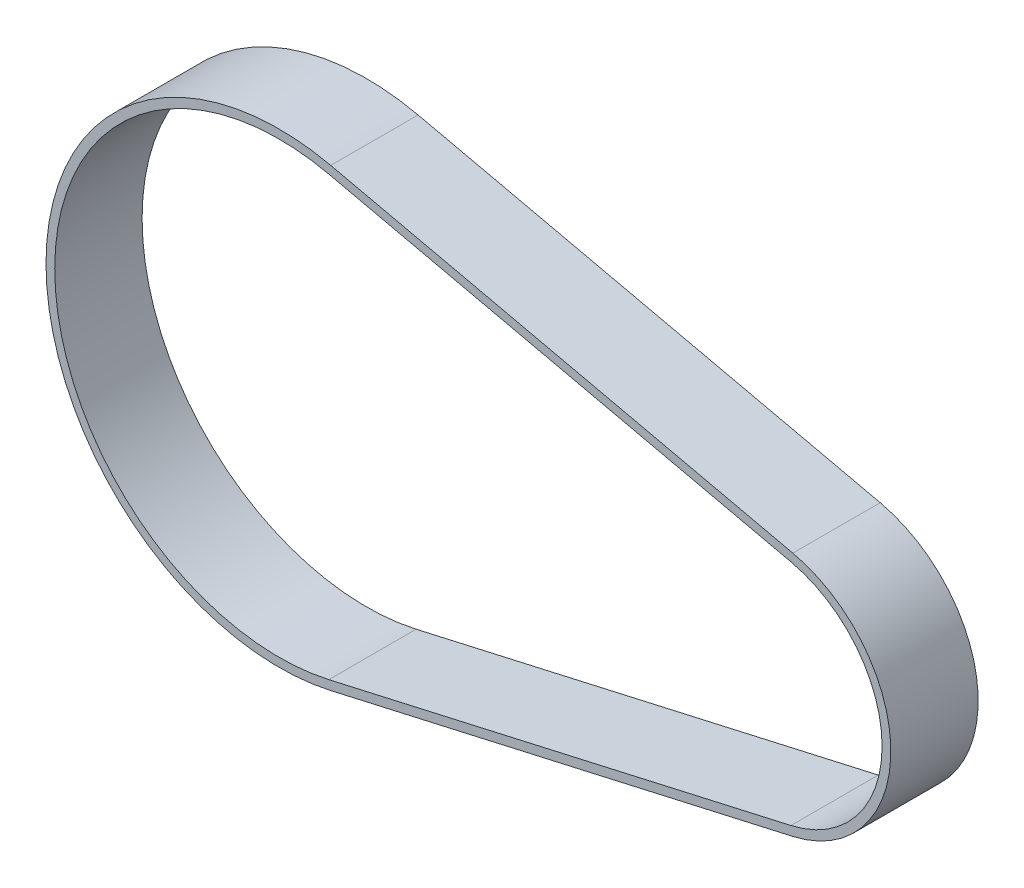
ISO-10303-21;
HEADER;
FILE_DESCRIPTION(('STEP AP214'),'2;1');
FILE_NAME('part.step','',(''),(''),'','','');
FILE_SCHEMA(('AUTOMOTIVE_DESIGN { 1 0 10303 214 1 1 1 1 }'));
ENDSEC;
DATA;
#1=APPLICATION_CONTEXT('core data for automotive mechanical design processes');
#2=APPLICATION_PROTOCOL_DEFINITION('international standard','automotive_design',2000,#1);
#3=PRODUCT_CONTEXT('',#1,'mechanical');
#4=PRODUCT('Part','Part','',(#3));
#5=PRODUCT_RELATED_PRODUCT_CATEGORY('part','',(#4));
#6=PRODUCT_DEFINITION_FORMATION('','',#4);
#7=PRODUCT_DEFINITION_CONTEXT('part definition',#1,'design');
#8=PRODUCT_DEFINITION('design','',#6,#7);
#9=PRODUCT_DEFINITION_SHAPE('','',#8);
#10=(LENGTH_UNIT() NAMED_UNIT(*) SI_UNIT(.MILLI.,.METRE.));
#11=(NAMED_UNIT(*) PLANE_ANGLE_UNIT() SI_UNIT($,.RADIAN.));
#12=(NAMED_UNIT(*) SI_UNIT($,.STERADIAN.) SOLID_ANGLE_UNIT());
#13=UNCERTAINTY_MEASURE_WITH_UNIT(LENGTH_MEASURE(1.E-05),#10,'distance_accuracy_value','');
#14=(GEOMETRIC_REPRESENTATION_CONTEXT(3) GLOBAL_UNCERTAINTY_ASSIGNED_CONTEXT((#13)) GLOBAL_UNIT_ASSIGNED_CONTEXT((#10,
#11,#12)) REPRESENTATION_CONTEXT('',''));
#15=CARTESIAN_POINT('',(0.,0.,0.));
#16=DIRECTION('',(0.,0.,1.));
#17=DIRECTION('',(1.,0.,0.));
#18=AXIS2_PLACEMENT_3D('',#15,#16,#17);
#19=CARTESIAN_POINT('',(0.,0.,10.));
#20=DIRECTION('',(0.,0.,-1.));
#21=DIRECTION('',(-1.,0.,0.));
#22=AXIS2_PLACEMENT_3D('',#19,#20,#21);
#23=PLANE('',#22);
#24=CARTESIAN_POINT('',(0.,0.,10.));
#25=DIRECTION('',(0.,0.,1.));
#26=DIRECTION('',(-1.,0.,0.));
#27=AXIS2_PLACEMENT_3D('',#24,#25,#26);
#28=CIRCLE('',#27,26.693005467257);
#29=CARTESIAN_POINT('',(5.90067497626424,26.0326444238672,10.));
#30=VERTEX_POINT('',#29);
#31=CARTESIAN_POINT('',(5.90067497626424,-26.0326444238672,10.));
#32=VERTEX_POINT('',#31);
#33=EDGE_CURVE('E134',#30,#32,#28,.T.);
#34=ORIENTED_EDGE('',*,*,#33,.T.);
#35=DIRECTION('',(0.975260895810332,0.221056972527964,0.));
#36=VECTOR('',#35,1.);
#37=CARTESIAN_POINT('',(58.7992391930494,-14.0424205698465,10.));
#38=LINE('',#37,#36);
#39=CARTESIAN_POINT('',(58.7992391930494,-14.0424205698465,10.));
#40=VERTEX_POINT('',#39);
#41=EDGE_CURVE('E137',#32,#40,#38,.T.);
#42=ORIENTED_EDGE('',*,*,#41,.T.);
#43=CARTESIAN_POINT('',(55.6163216871081,0.,10.));
#44=DIRECTION('',(0.,0.,1.));
#45=DIRECTION('',(-1.,0.,0.));
#46=AXIS2_PLACEMENT_3D('',#43,#44,#45);
#47=CIRCLE('',#46,14.3986297719636);
#48=CARTESIAN_POINT('',(58.7992391930494,14.0424205698465,10.));
#49=VERTEX_POINT('',#48);
#50=EDGE_CURVE('E140',#40,#49,#47,.T.);
#51=ORIENTED_EDGE('',*,*,#50,.T.);
#52=DIRECTION('',(-0.975260895810332,0.221056972527964,0.));
#53=VECTOR('',#52,1.);
#54=CARTESIAN_POINT('',(5.90067497626424,26.0326444238672,10.));
#55=LINE('',#54,#53);
#56=EDGE_CURVE('E142',#49,#30,#55,.T.);
#57=ORIENTED_EDGE('',*,*,#56,.T.);
#58=EDGE_LOOP('',(#34,#42,#51,#57));
#59=FACE_BOUND('',#58,.T.);
#60=CARTESIAN_POINT('',(0.,0.,10.));
#61=DIRECTION('',(0.,0.,1.));
#62=DIRECTION('',(-1.,0.,0.));
#63=AXIS2_PLACEMENT_3D('',#60,#61,#62);
#64=CIRCLE('',#63,25.6930054672571);
#65=CARTESIAN_POINT('',(5.67961800373628,25.0573835280569,10.));
#66=VERTEX_POINT('',#65);
#67=CARTESIAN_POINT('',(5.67961800373628,-25.0573835280569,10.));
#68=VERTEX_POINT('',#67);
#69=EDGE_CURVE('E98',#66,#68,#64,.T.);
#70=ORIENTED_EDGE('',*,*,#69,.F.);
#71=DIRECTION('',(-0.975260895810332,0.221056972527964,0.));
#72=VECTOR('',#71,1.);
#73=CARTESIAN_POINT('',(5.67961800373628,25.0573835280569,10.));
#74=LINE('',#73,#72);
#75=CARTESIAN_POINT('',(58.5781822205214,13.0671596740362,10.));
#76=VERTEX_POINT('',#75);
#77=EDGE_CURVE('E120',#76,#66,#74,.T.);
#78=ORIENTED_EDGE('',*,*,#77,.F.);
#79=CARTESIAN_POINT('',(55.6163216871081,0.,10.));
#80=DIRECTION('',(0.,0.,1.));
#81=DIRECTION('',(-1.,0.,0.));
#82=AXIS2_PLACEMENT_3D('',#79,#80,#81);
#83=CIRCLE('',#82,13.3986297719636);
#84=CARTESIAN_POINT('',(58.5781822205214,-13.0671596740362,10.));
#85=VERTEX_POINT('',#84);
#86=EDGE_CURVE('E118',#85,#76,#83,.T.);
#87=ORIENTED_EDGE('',*,*,#86,.F.);
#88=DIRECTION('',(0.975260895810332,0.221056972527964,0.));
#89=VECTOR('',#88,1.);
#90=CARTESIAN_POINT('',(58.5781822205214,-13.0671596740362,10.));
#91=LINE('',#90,#89);
#92=EDGE_CURVE('E106',#68,#85,#91,.T.);
#93=ORIENTED_EDGE('',*,*,#92,.F.);
#94=EDGE_LOOP('',(#70,#78,#87,#93));
#95=FACE_BOUND('',#94,.T.);
#96=ADVANCED_FACE('F33',(#59,#95),#23,.F.);
#97=CARTESIAN_POINT('',(0.,0.,0.));
#98=DIRECTION('',(0.,0.,-1.));
#99=DIRECTION('',(-1.,0.,0.));
#100=AXIS2_PLACEMENT_3D('',#97,#98,#99);
#101=PLANE('',#100);
#102=CARTESIAN_POINT('',(0.,0.,0.));
#103=DIRECTION('',(0.,0.,1.));
#104=DIRECTION('',(-1.,0.,0.));
#105=AXIS2_PLACEMENT_3D('',#102,#103,#104);
#106=CIRCLE('',#105,26.693005467257);
#107=CARTESIAN_POINT('',(5.90067497626424,26.0326444238672,0.));
#108=VERTEX_POINT('',#107);
#109=CARTESIAN_POINT('',(5.90067497626424,-26.0326444238672,0.));
#110=VERTEX_POINT('',#109);
#111=EDGE_CURVE('E114',#108,#110,#106,.T.);
#112=ORIENTED_EDGE('',*,*,#111,.F.);
#113=DIRECTION('',(-0.975260895810332,0.221056972527964,0.));
#114=VECTOR('',#113,1.);
#115=CARTESIAN_POINT('',(5.90067497626424,26.0326444238672,0.));
#116=LINE('',#115,#114);
#117=CARTESIAN_POINT('',(58.7992391930494,14.0424205698465,0.));
#118=VERTEX_POINT('',#117);
#119=EDGE_CURVE('E138',#118,#108,#116,.T.);
#120=ORIENTED_EDGE('',*,*,#119,.F.);
#121=CARTESIAN_POINT('',(55.6163216871081,0.,0.));
#122=DIRECTION('',(0.,0.,1.));
#123=DIRECTION('',(-1.,0.,0.));
#124=AXIS2_PLACEMENT_3D('',#121,#122,#123);
#125=CIRCLE('',#124,14.3986297719636);
#126=CARTESIAN_POINT('',(58.7992391930494,-14.0424205698465,0.));
#127=VERTEX_POINT('',#126);
#128=EDGE_CURVE('E149',#127,#118,#125,.T.);
#129=ORIENTED_EDGE('',*,*,#128,.F.);
#130=DIRECTION('',(0.975260895810332,0.221056972527964,0.));
#131=VECTOR('',#130,1.);
#132=CARTESIAN_POINT('',(58.7992391930494,-14.0424205698465,0.));
#133=LINE('',#132,#131);
#134=EDGE_CURVE('E147',#110,#127,#133,.T.);
#135=ORIENTED_EDGE('',*,*,#134,.F.);
#136=EDGE_LOOP('',(#112,#120,#129,#135));
#137=FACE_BOUND('',#136,.T.);
#138=DIRECTION('',(-0.975260895810332,0.221056972527964,0.));
#139=VECTOR('',#138,1.);
#140=CARTESIAN_POINT('',(5.67961800373628,25.0573835280569,0.));
#141=LINE('',#140,#139);
#142=CARTESIAN_POINT('',(58.5781822205214,13.0671596740362,0.));
#143=VERTEX_POINT('',#142);
#144=CARTESIAN_POINT('',(5.67961800373628,25.0573835280569,0.));
#145=VERTEX_POINT('',#144);
#146=EDGE_CURVE('E107',#143,#145,#141,.T.);
#147=ORIENTED_EDGE('',*,*,#146,.T.);
#148=CARTESIAN_POINT('',(0.,0.,0.));
#149=DIRECTION('',(0.,0.,1.));
#150=DIRECTION('',(-1.,0.,0.));
#151=AXIS2_PLACEMENT_3D('',#148,#149,#150);
#152=CIRCLE('',#151,25.6930054672571);
#153=CARTESIAN_POINT('',(5.67961800373628,-25.0573835280569,0.));
#154=VERTEX_POINT('',#153);
#155=EDGE_CURVE('E56',#145,#154,#152,.T.);
#156=ORIENTED_EDGE('',*,*,#155,.T.);
#157=DIRECTION('',(0.975260895810332,0.221056972527964,0.));
#158=VECTOR('',#157,1.);
#159=CARTESIAN_POINT('',(58.5781822205214,-13.0671596740362,0.));
#160=LINE('',#159,#158);
#161=CARTESIAN_POINT('',(58.5781822205214,-13.0671596740362,0.));
#162=VERTEX_POINT('',#161);
#163=EDGE_CURVE('E113',#154,#162,#160,.T.);
#164=ORIENTED_EDGE('',*,*,#163,.T.);
#165=CARTESIAN_POINT('',(55.6163216871081,0.,0.));
#166=DIRECTION('',(0.,0.,1.));
#167=DIRECTION('',(-1.,0.,0.));
#168=AXIS2_PLACEMENT_3D('',#165,#166,#167);
#169=CIRCLE('',#168,13.3986297719636);
#170=EDGE_CURVE('E126',#162,#143,#169,.T.);
#171=ORIENTED_EDGE('',*,*,#170,.T.);
#172=EDGE_LOOP('',(#147,#156,#164,#171));
#173=FACE_BOUND('',#172,.T.);
#174=ADVANCED_FACE('F167',(#137,#173),#101,.T.);
#175=CARTESIAN_POINT('',(0.,0.,10.));
#176=DIRECTION('',(0.,0.,-1.));
#177=DIRECTION('',(-1.,0.,0.));
#178=AXIS2_PLACEMENT_3D('',#175,#176,#177);
#179=CYLINDRICAL_SURFACE('',#178,26.693005467257);
#180=ORIENTED_EDGE('',*,*,#111,.T.);
#181=DIRECTION('',(0.,0.,-1.));
#182=VECTOR('',#181,1.);
#183=CARTESIAN_POINT('',(5.90067497626424,-26.0326444238672,10.));
#184=LINE('',#183,#182);
#185=EDGE_CURVE('E11',#32,#110,#184,.T.);
#186=ORIENTED_EDGE('',*,*,#185,.F.);
#187=ORIENTED_EDGE('',*,*,#33,.F.);
#188=DIRECTION('',(0.,0.,-1.));
#189=VECTOR('',#188,1.);
#190=CARTESIAN_POINT('',(5.90067497626424,26.0326444238672,10.));
#191=LINE('',#190,#189);
#192=EDGE_CURVE('E144',#30,#108,#191,.T.);
#193=ORIENTED_EDGE('',*,*,#192,.T.);
#194=EDGE_LOOP('',(#180,#186,#187,#193));
#195=FACE_BOUND('',#194,.T.);
#196=ADVANCED_FACE('F35',(#195),#179,.T.);
#197=CARTESIAN_POINT('',(58.7992391930494,-14.0424205698465,10.));
#198=DIRECTION('',(-0.221056972527964,0.975260895810332,0.));
#199=DIRECTION('',(-0.975260895810332,-0.221056972527964,0.));
#200=AXIS2_PLACEMENT_3D('',#197,#198,#199);
#201=PLANE('',#200);
#202=ORIENTED_EDGE('',*,*,#134,.T.);
#203=DIRECTION('',(0.,0.,-1.));
#204=VECTOR('',#203,1.);
#205=CARTESIAN_POINT('',(58.7992391930494,-14.0424205698465,10.));
#206=LINE('',#205,#204);
#207=EDGE_CURVE('E41',#40,#127,#206,.T.);
#208=ORIENTED_EDGE('',*,*,#207,.F.);
#209=ORIENTED_EDGE('',*,*,#41,.F.);
#210=ORIENTED_EDGE('',*,*,#185,.T.);
#211=EDGE_LOOP('',(#202,#208,#209,#210));
#212=FACE_BOUND('',#211,.T.);
#213=ADVANCED_FACE('F177',(#212),#201,.F.);
#214=CARTESIAN_POINT('',(55.6163216871081,0.,10.));
#215=DIRECTION('',(0.,0.,-1.));
#216=DIRECTION('',(-1.,0.,0.));
#217=AXIS2_PLACEMENT_3D('',#214,#215,#216);
#218=CYLINDRICAL_SURFACE('',#217,14.3986297719636);
#219=ORIENTED_EDGE('',*,*,#128,.T.);
#220=DIRECTION('',(0.,0.,-1.));
#221=VECTOR('',#220,1.);
#222=CARTESIAN_POINT('',(58.7992391930494,14.0424205698465,10.));
#223=LINE('',#222,#221);
#224=EDGE_CURVE('E154',#49,#118,#223,.T.);
#225=ORIENTED_EDGE('',*,*,#224,.F.);
#226=ORIENTED_EDGE('',*,*,#50,.F.);
#227=ORIENTED_EDGE('',*,*,#207,.T.);
#228=EDGE_LOOP('',(#219,#225,#226,#227));
#229=FACE_BOUND('',#228,.T.);
#230=ADVANCED_FACE('F161',(#229),#218,.T.);
#231=CARTESIAN_POINT('',(5.90067497626424,26.0326444238672,10.));
#232=DIRECTION('',(-0.221056972527964,-0.975260895810332,0.));
#233=DIRECTION('',(0.975260895810332,-0.221056972527964,0.));
#234=AXIS2_PLACEMENT_3D('',#231,#232,#233);
#235=PLANE('',#234);
#236=ORIENTED_EDGE('',*,*,#119,.T.);
#237=ORIENTED_EDGE('',*,*,#192,.F.);
#238=ORIENTED_EDGE('',*,*,#56,.F.);
#239=ORIENTED_EDGE('',*,*,#224,.T.);
#240=EDGE_LOOP('',(#236,#237,#238,#239));
#241=FACE_BOUND('',#240,.T.);
#242=ADVANCED_FACE('F171',(#241),#235,.F.);
#243=CARTESIAN_POINT('',(0.,0.,10.));
#244=DIRECTION('',(0.,0.,-1.));
#245=DIRECTION('',(-1.,0.,0.));
#246=AXIS2_PLACEMENT_3D('',#243,#244,#245);
#247=CYLINDRICAL_SURFACE('',#246,25.6930054672571);
#248=ORIENTED_EDGE('',*,*,#155,.F.);
#249=DIRECTION('',(0.,0.,-1.));
#250=VECTOR('',#249,1.);
#251=CARTESIAN_POINT('',(5.67961800373628,25.0573835280569,10.));
#252=LINE('',#251,#250);
#253=EDGE_CURVE('E102',#66,#145,#252,.T.);
#254=ORIENTED_EDGE('',*,*,#253,.F.);
#255=ORIENTED_EDGE('',*,*,#69,.T.);
#256=DIRECTION('',(0.,0.,-1.));
#257=VECTOR('',#256,1.);
#258=CARTESIAN_POINT('',(5.67961800373628,-25.0573835280569,10.));
#259=LINE('',#258,#257);
#260=EDGE_CURVE('E101',#68,#154,#259,.T.);
#261=ORIENTED_EDGE('',*,*,#260,.T.);
#262=EDGE_LOOP('',(#248,#254,#255,#261));
#263=FACE_BOUND('',#262,.T.);
#264=ADVANCED_FACE('F100',(#263),#247,.F.);
#265=CARTESIAN_POINT('',(58.5781822205214,-13.0671596740362,10.));
#266=DIRECTION('',(-0.221056972527964,0.975260895810332,0.));
#267=DIRECTION('',(-0.975260895810332,-0.221056972527964,0.));
#268=AXIS2_PLACEMENT_3D('',#265,#266,#267);
#269=PLANE('',#268);
#270=ORIENTED_EDGE('',*,*,#163,.F.);
#271=ORIENTED_EDGE('',*,*,#260,.F.);
#272=ORIENTED_EDGE('',*,*,#92,.T.);
#273=DIRECTION('',(0.,0.,-1.));
#274=VECTOR('',#273,1.);
#275=CARTESIAN_POINT('',(58.5781822205214,-13.0671596740362,10.));
#276=LINE('',#275,#274);
#277=EDGE_CURVE('E115',#85,#162,#276,.T.);
#278=ORIENTED_EDGE('',*,*,#277,.T.);
#279=EDGE_LOOP('',(#270,#271,#272,#278));
#280=FACE_BOUND('',#279,.T.);
#281=ADVANCED_FACE('F110',(#280),#269,.T.);
#282=CARTESIAN_POINT('',(55.6163216871081,0.,10.));
#283=DIRECTION('',(0.,0.,-1.));
#284=DIRECTION('',(-1.,0.,0.));
#285=AXIS2_PLACEMENT_3D('',#282,#283,#284);
#286=CYLINDRICAL_SURFACE('',#285,13.3986297719636);
#287=ORIENTED_EDGE('',*,*,#170,.F.);
#288=ORIENTED_EDGE('',*,*,#277,.F.);
#289=ORIENTED_EDGE('',*,*,#86,.T.);
#290=DIRECTION('',(0.,0.,-1.));
#291=VECTOR('',#290,1.);
#292=CARTESIAN_POINT('',(58.5781822205214,13.0671596740362,10.));
#293=LINE('',#292,#291);
#294=EDGE_CURVE('E48',#76,#143,#293,.T.);
#295=ORIENTED_EDGE('',*,*,#294,.T.);
#296=EDGE_LOOP('',(#287,#288,#289,#295));
#297=FACE_BOUND('',#296,.T.);
#298=ADVANCED_FACE('F200',(#297),#286,.F.);
#299=CARTESIAN_POINT('',(5.67961800373628,25.0573835280569,10.));
#300=DIRECTION('',(-0.221056972527964,-0.975260895810332,0.));
#301=DIRECTION('',(0.975260895810332,-0.221056972527964,0.));
#302=AXIS2_PLACEMENT_3D('',#299,#300,#301);
#303=PLANE('',#302);
#304=ORIENTED_EDGE('',*,*,#146,.F.);
#305=ORIENTED_EDGE('',*,*,#294,.F.);
#306=ORIENTED_EDGE('',*,*,#77,.T.);
#307=ORIENTED_EDGE('',*,*,#253,.T.);
#308=EDGE_LOOP('',(#304,#305,#306,#307));
#309=FACE_BOUND('',#308,.T.);
#310=ADVANCED_FACE('F204',(#309),#303,.T.);
#311=CLOSED_SHELL('',(#96,#174,#196,#213,#230,#242,#264,#281,#298,#310));
#312=MANIFOLD_SOLID_BREP('B2',#311);
#313=ADVANCED_BREP_SHAPE_REPRESENTATION('',(#18,#312),#14);
#314=SHAPE_DEFINITION_REPRESENTATION(#9,#313);
ENDSEC;
END-ISO-10303-21;
